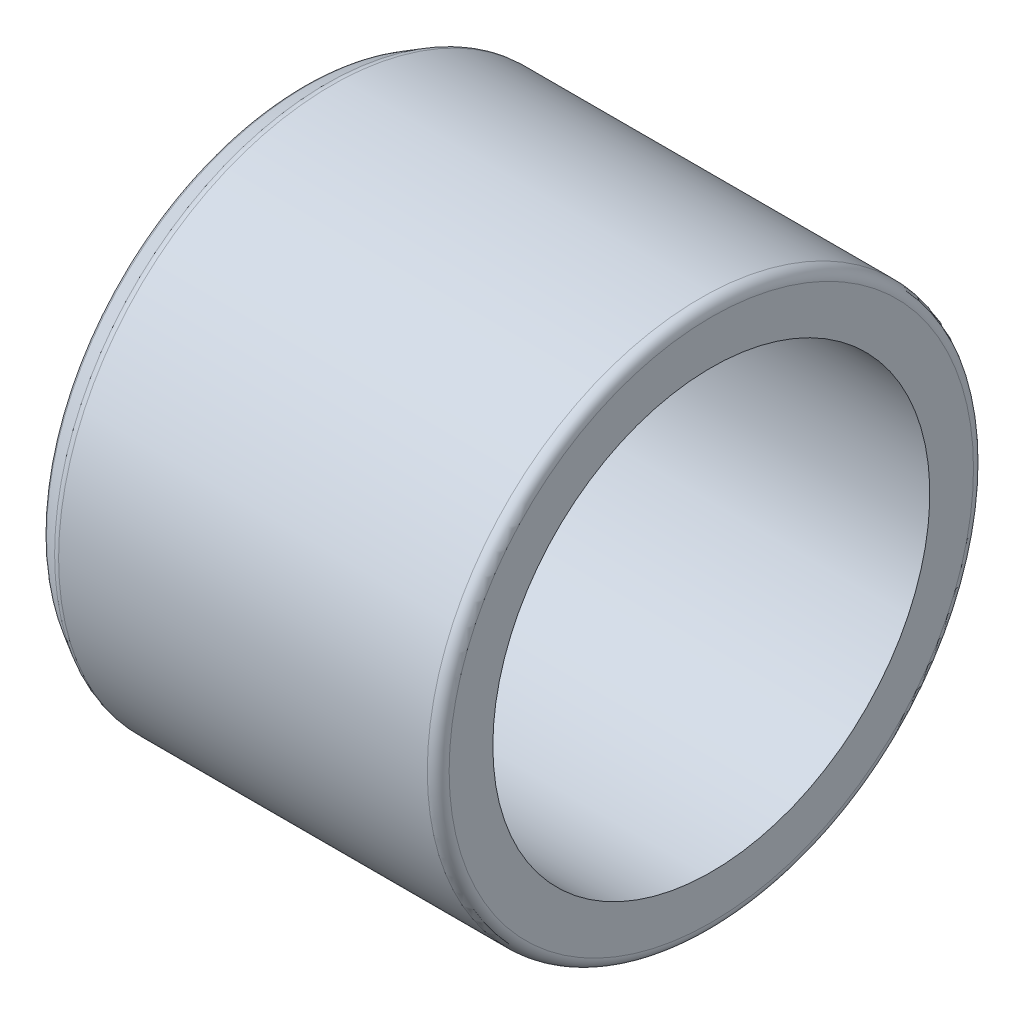
ISO-10303-21;
HEADER;
FILE_DESCRIPTION(('STEP AP214'),'2;1');
FILE_NAME('part.step','',(''),(''),'','','');
FILE_SCHEMA(('AUTOMOTIVE_DESIGN { 1 0 10303 214 1 1 1 1 }'));
ENDSEC;
DATA;
#1=APPLICATION_CONTEXT('core data for automotive mechanical design processes');
#2=APPLICATION_PROTOCOL_DEFINITION('international standard','automotive_design',2000,#1);
#3=PRODUCT_CONTEXT('',#1,'mechanical');
#4=PRODUCT('Part','Part','',(#3));
#5=PRODUCT_RELATED_PRODUCT_CATEGORY('part','',(#4));
#6=PRODUCT_DEFINITION_FORMATION('','',#4);
#7=PRODUCT_DEFINITION_CONTEXT('part definition',#1,'design');
#8=PRODUCT_DEFINITION('design','',#6,#7);
#9=PRODUCT_DEFINITION_SHAPE('','',#8);
#10=(LENGTH_UNIT() NAMED_UNIT(*) SI_UNIT(.MILLI.,.METRE.));
#11=(NAMED_UNIT(*) PLANE_ANGLE_UNIT() SI_UNIT($,.RADIAN.));
#12=(NAMED_UNIT(*) SI_UNIT($,.STERADIAN.) SOLID_ANGLE_UNIT());
#13=UNCERTAINTY_MEASURE_WITH_UNIT(LENGTH_MEASURE(1.E-05),#10,'distance_accuracy_value','');
#14=(GEOMETRIC_REPRESENTATION_CONTEXT(3) GLOBAL_UNCERTAINTY_ASSIGNED_CONTEXT((#13)) GLOBAL_UNIT_ASSIGNED_CONTEXT((#10,
#11,#12)) REPRESENTATION_CONTEXT('',''));
#15=CARTESIAN_POINT('',(0.,0.,0.));
#16=DIRECTION('',(0.,0.,1.));
#17=DIRECTION('',(1.,0.,0.));
#18=AXIS2_PLACEMENT_3D('',#15,#16,#17);
#19=CARTESIAN_POINT('',(-18.75,0.,0.));
#20=DIRECTION('',(-1.,0.,0.));
#21=DIRECTION('',(0.,0.,1.));
#22=AXIS2_PLACEMENT_3D('',#19,#20,#21);
#23=CYLINDRICAL_SURFACE('',#22,20.);
#24=CARTESIAN_POINT('',(18.75,0.,0.));
#25=DIRECTION('',(-1.,0.,0.));
#26=DIRECTION('',(0.,0.,1.));
#27=AXIS2_PLACEMENT_3D('',#24,#25,#26);
#28=CIRCLE('',#27,20.);
#29=CARTESIAN_POINT('',(18.75,0.,20.));
#30=VERTEX_POINT('',#29);
#31=EDGE_CURVE('E10',#30,#30,#28,.T.);
#32=ORIENTED_EDGE('',*,*,#31,.F.);
#33=EDGE_LOOP('',(#32));
#34=FACE_BOUND('',#33,.T.);
#35=CARTESIAN_POINT('',(-16.,0.,0.));
#36=DIRECTION('',(-1.,0.,0.));
#37=DIRECTION('',(0.,0.,1.));
#38=AXIS2_PLACEMENT_3D('',#35,#36,#37);
#39=CIRCLE('',#38,20.);
#40=CARTESIAN_POINT('',(-16.,0.,20.));
#41=VERTEX_POINT('',#40);
#42=EDGE_CURVE('E69',#41,#41,#39,.T.);
#43=ORIENTED_EDGE('',*,*,#42,.T.);
#44=EDGE_LOOP('',(#43));
#45=FACE_BOUND('',#44,.T.);
#46=ADVANCED_FACE('F32',(#34,#45),#23,.F.);
#47=CARTESIAN_POINT('',(18.75,20.,0.));
#48=DIRECTION('',(-1.,0.,0.));
#49=DIRECTION('',(0.,0.,1.));
#50=AXIS2_PLACEMENT_3D('',#47,#48,#49);
#51=PLANE('',#50);
#52=CARTESIAN_POINT('',(18.75,0.,0.));
#53=DIRECTION('',(-1.,0.,0.));
#54=DIRECTION('',(0.,0.,1.));
#55=AXIS2_PLACEMENT_3D('',#52,#53,#54);
#56=CIRCLE('',#55,24.);
#57=CARTESIAN_POINT('',(18.75,0.,24.));
#58=VERTEX_POINT('',#57);
#59=EDGE_CURVE('E38',#58,#58,#56,.T.);
#60=ORIENTED_EDGE('',*,*,#59,.F.);
#61=EDGE_LOOP('',(#60));
#62=FACE_BOUND('',#61,.T.);
#63=ORIENTED_EDGE('',*,*,#31,.T.);
#64=EDGE_LOOP('',(#63));
#65=FACE_BOUND('',#64,.T.);
#66=ADVANCED_FACE('F124',(#62,#65),#51,.F.);
#67=CARTESIAN_POINT('',(17.75,0.,0.));
#68=DIRECTION('',(-1.,0.,0.));
#69=DIRECTION('',(0.,0.,1.));
#70=AXIS2_PLACEMENT_3D('',#67,#68,#69);
#71=TOROIDAL_SURFACE('',#70,24.,1.);
#72=CARTESIAN_POINT('',(17.75,0.,0.));
#73=DIRECTION('',(-1.,0.,0.));
#74=DIRECTION('',(0.,0.,1.));
#75=AXIS2_PLACEMENT_3D('',#72,#73,#74);
#76=CIRCLE('',#75,25.);
#77=CARTESIAN_POINT('',(17.75,0.,25.));
#78=VERTEX_POINT('',#77);
#79=EDGE_CURVE('E42',#78,#78,#76,.T.);
#80=ORIENTED_EDGE('',*,*,#79,.F.);
#81=EDGE_LOOP('',(#80));
#82=FACE_BOUND('',#81,.T.);
#83=ORIENTED_EDGE('',*,*,#59,.T.);
#84=EDGE_LOOP('',(#83));
#85=FACE_BOUND('',#84,.T.);
#86=ADVANCED_FACE('F119',(#82,#85),#71,.T.);
#87=CARTESIAN_POINT('',(-18.75,0.,0.));
#88=DIRECTION('',(-1.,0.,0.));
#89=DIRECTION('',(0.,0.,1.));
#90=AXIS2_PLACEMENT_3D('',#87,#88,#89);
#91=CYLINDRICAL_SURFACE('',#90,25.);
#92=CARTESIAN_POINT('',(-16.,0.,0.));
#93=DIRECTION('',(-1.,0.,0.));
#94=DIRECTION('',(0.,0.,1.));
#95=AXIS2_PLACEMENT_3D('',#92,#93,#94);
#96=CIRCLE('',#95,25.);
#97=CARTESIAN_POINT('',(-16.,0.,25.));
#98=VERTEX_POINT('',#97);
#99=EDGE_CURVE('E46',#98,#98,#96,.T.);
#100=ORIENTED_EDGE('',*,*,#99,.F.);
#101=EDGE_LOOP('',(#100));
#102=FACE_BOUND('',#101,.T.);
#103=ORIENTED_EDGE('',*,*,#79,.T.);
#104=EDGE_LOOP('',(#103));
#105=FACE_BOUND('',#104,.T.);
#106=ADVANCED_FACE('F113',(#102,#105),#91,.T.);
#107=CARTESIAN_POINT('',(-16.,0.,0.));
#108=DIRECTION('',(-1.,0.,0.));
#109=DIRECTION('',(0.,0.,1.));
#110=AXIS2_PLACEMENT_3D('',#107,#108,#109);
#111=TOROIDAL_SURFACE('',#110,24.,1.);
#112=CARTESIAN_POINT('',(-16.5,0.,0.));
#113=DIRECTION('',(-1.,0.,0.));
#114=DIRECTION('',(0.,0.,1.));
#115=AXIS2_PLACEMENT_3D('',#112,#113,#114);
#116=CIRCLE('',#115,24.8660254037844);
#117=CARTESIAN_POINT('',(-16.5,0.,24.8660254037844));
#118=VERTEX_POINT('',#117);
#119=EDGE_CURVE('E51',#118,#118,#116,.T.);
#120=ORIENTED_EDGE('',*,*,#119,.F.);
#121=EDGE_LOOP('',(#120));
#122=FACE_BOUND('',#121,.T.);
#123=ORIENTED_EDGE('',*,*,#99,.T.);
#124=EDGE_LOOP('',(#123));
#125=FACE_BOUND('',#124,.T.);
#126=ADVANCED_FACE('F107',(#122,#125),#111,.T.);
#127=CARTESIAN_POINT('',(-16.5,0.,0.));
#128=DIRECTION('',(1.,0.,0.));
#129=DIRECTION('',(0.,0.,-1.));
#130=AXIS2_PLACEMENT_3D('',#127,#128,#129);
#131=CONICAL_SURFACE('',#130,24.8660254037844,0.523598775598295);
#132=CARTESIAN_POINT('',(-18.25,0.,0.));
#133=DIRECTION('',(-1.,0.,0.));
#134=DIRECTION('',(0.,0.,1.));
#135=AXIS2_PLACEMENT_3D('',#132,#133,#134);
#136=CIRCLE('',#135,23.8556624327026);
#137=CARTESIAN_POINT('',(-18.25,0.,23.8556624327026));
#138=VERTEX_POINT('',#137);
#139=EDGE_CURVE('E54',#138,#138,#136,.T.);
#140=ORIENTED_EDGE('',*,*,#139,.F.);
#141=EDGE_LOOP('',(#140));
#142=FACE_BOUND('',#141,.T.);
#143=ORIENTED_EDGE('',*,*,#119,.T.);
#144=EDGE_LOOP('',(#143));
#145=FACE_BOUND('',#144,.T.);
#146=ADVANCED_FACE('F101',(#142,#145),#131,.T.);
#147=CARTESIAN_POINT('',(-17.75,0.,0.));
#148=DIRECTION('',(-1.,0.,0.));
#149=DIRECTION('',(0.,0.,1.));
#150=AXIS2_PLACEMENT_3D('',#147,#148,#149);
#151=TOROIDAL_SURFACE('',#150,22.9896370289182,1.);
#152=CARTESIAN_POINT('',(-18.75,0.,0.));
#153=DIRECTION('',(-1.,0.,0.));
#154=DIRECTION('',(0.,0.,1.));
#155=AXIS2_PLACEMENT_3D('',#152,#153,#154);
#156=CIRCLE('',#155,22.9896370289182);
#157=CARTESIAN_POINT('',(-18.75,0.,22.9896370289182));
#158=VERTEX_POINT('',#157);
#159=EDGE_CURVE('E57',#158,#158,#156,.T.);
#160=ORIENTED_EDGE('',*,*,#159,.F.);
#161=EDGE_LOOP('',(#160));
#162=FACE_BOUND('',#161,.T.);
#163=ORIENTED_EDGE('',*,*,#139,.T.);
#164=EDGE_LOOP('',(#163));
#165=FACE_BOUND('',#164,.T.);
#166=ADVANCED_FACE('F95',(#162,#165),#151,.T.);
#167=CARTESIAN_POINT('',(-18.75,22.9896370289182,0.));
#168=DIRECTION('',(1.,0.,0.));
#169=DIRECTION('',(0.,0.,-1.));
#170=AXIS2_PLACEMENT_3D('',#167,#168,#169);
#171=PLANE('',#170);
#172=CARTESIAN_POINT('',(-18.75,0.,0.));
#173=DIRECTION('',(-1.,0.,0.));
#174=DIRECTION('',(0.,0.,1.));
#175=AXIS2_PLACEMENT_3D('',#172,#173,#174);
#176=CIRCLE('',#175,19.1);
#177=CARTESIAN_POINT('',(-18.75,0.,19.1));
#178=VERTEX_POINT('',#177);
#179=EDGE_CURVE('E60',#178,#178,#176,.T.);
#180=ORIENTED_EDGE('',*,*,#179,.F.);
#181=EDGE_LOOP('',(#180));
#182=FACE_BOUND('',#181,.T.);
#183=ORIENTED_EDGE('',*,*,#159,.T.);
#184=EDGE_LOOP('',(#183));
#185=FACE_BOUND('',#184,.T.);
#186=ADVANCED_FACE('F89',(#182,#185),#171,.F.);
#187=CARTESIAN_POINT('',(-17.75,0.,0.));
#188=DIRECTION('',(-1.,0.,0.));
#189=DIRECTION('',(0.,0.,1.));
#190=AXIS2_PLACEMENT_3D('',#187,#188,#189);
#191=TOROIDAL_SURFACE('',#190,19.1,0.999999999999999);
#192=CARTESIAN_POINT('',(-17.75,0.,0.));
#193=DIRECTION('',(-1.,0.,0.));
#194=DIRECTION('',(0.,0.,1.));
#195=AXIS2_PLACEMENT_3D('',#192,#193,#194);
#196=CIRCLE('',#195,18.1);
#197=CARTESIAN_POINT('',(-17.75,0.,18.1));
#198=VERTEX_POINT('',#197);
#199=EDGE_CURVE('E63',#198,#198,#196,.T.);
#200=ORIENTED_EDGE('',*,*,#199,.F.);
#201=EDGE_LOOP('',(#200));
#202=FACE_BOUND('',#201,.T.);
#203=ORIENTED_EDGE('',*,*,#179,.T.);
#204=EDGE_LOOP('',(#203));
#205=FACE_BOUND('',#204,.T.);
#206=ADVANCED_FACE('F83',(#202,#205),#191,.T.);
#207=CARTESIAN_POINT('',(-18.75,0.,0.));
#208=DIRECTION('',(-1.,0.,0.));
#209=DIRECTION('',(0.,0.,1.));
#210=AXIS2_PLACEMENT_3D('',#207,#208,#209);
#211=CYLINDRICAL_SURFACE('',#210,18.1);
#212=CARTESIAN_POINT('',(-16.,0.,0.));
#213=DIRECTION('',(-1.,0.,0.));
#214=DIRECTION('',(0.,0.,1.));
#215=AXIS2_PLACEMENT_3D('',#212,#213,#214);
#216=CIRCLE('',#215,18.1);
#217=CARTESIAN_POINT('',(-16.,0.,18.1));
#218=VERTEX_POINT('',#217);
#219=EDGE_CURVE('E66',#218,#218,#216,.T.);
#220=ORIENTED_EDGE('',*,*,#219,.F.);
#221=EDGE_LOOP('',(#220));
#222=FACE_BOUND('',#221,.T.);
#223=ORIENTED_EDGE('',*,*,#199,.T.);
#224=EDGE_LOOP('',(#223));
#225=FACE_BOUND('',#224,.T.);
#226=ADVANCED_FACE('F77',(#222,#225),#211,.F.);
#227=CARTESIAN_POINT('',(-16.,18.1,0.));
#228=DIRECTION('',(-1.,0.,0.));
#229=DIRECTION('',(0.,0.,1.));
#230=AXIS2_PLACEMENT_3D('',#227,#228,#229);
#231=PLANE('',#230);
#232=ORIENTED_EDGE('',*,*,#42,.F.);
#233=EDGE_LOOP('',(#232));
#234=FACE_BOUND('',#233,.T.);
#235=ORIENTED_EDGE('',*,*,#219,.T.);
#236=EDGE_LOOP('',(#235));
#237=FACE_BOUND('',#236,.T.);
#238=ADVANCED_FACE('F74',(#234,#237),#231,.F.);
#239=CLOSED_SHELL('',(#46,#66,#86,#106,#126,#146,#166,#186,#206,#226,#238));
#240=MANIFOLD_SOLID_BREP('B2',#239);
#241=ADVANCED_BREP_SHAPE_REPRESENTATION('',(#18,#240),#14);
#242=SHAPE_DEFINITION_REPRESENTATION(#9,#241);
ENDSEC;
END-ISO-10303-21;
